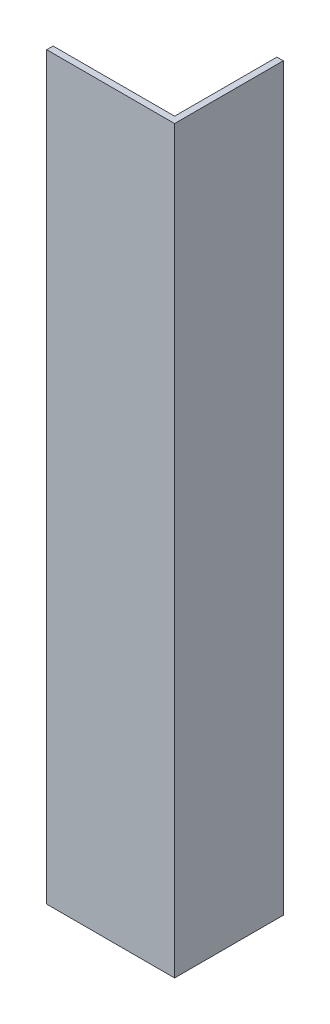
ISO-10303-21;
HEADER;
FILE_DESCRIPTION(('STEP AP214'),'2;1');
FILE_NAME('part.step','',(''),(''),'','','');
FILE_SCHEMA(('AUTOMOTIVE_DESIGN { 1 0 10303 214 1 1 1 1 }'));
ENDSEC;
DATA;
#1=APPLICATION_CONTEXT('core data for automotive mechanical design processes');
#2=APPLICATION_PROTOCOL_DEFINITION('international standard','automotive_design',2000,#1);
#3=PRODUCT_CONTEXT('',#1,'mechanical');
#4=PRODUCT('Part','Part','',(#3));
#5=PRODUCT_RELATED_PRODUCT_CATEGORY('part','',(#4));
#6=PRODUCT_DEFINITION_FORMATION('','',#4);
#7=PRODUCT_DEFINITION_CONTEXT('part definition',#1,'design');
#8=PRODUCT_DEFINITION('design','',#6,#7);
#9=PRODUCT_DEFINITION_SHAPE('','',#8);
#10=(LENGTH_UNIT() NAMED_UNIT(*) SI_UNIT(.MILLI.,.METRE.));
#11=(NAMED_UNIT(*) PLANE_ANGLE_UNIT() SI_UNIT($,.RADIAN.));
#12=(NAMED_UNIT(*) SI_UNIT($,.STERADIAN.) SOLID_ANGLE_UNIT());
#13=UNCERTAINTY_MEASURE_WITH_UNIT(LENGTH_MEASURE(1.E-05),#10,'distance_accuracy_value','');
#14=(GEOMETRIC_REPRESENTATION_CONTEXT(3) GLOBAL_UNCERTAINTY_ASSIGNED_CONTEXT((#13)) GLOBAL_UNIT_ASSIGNED_CONTEXT((#10,
#11,#12)) REPRESENTATION_CONTEXT('',''));
#15=CARTESIAN_POINT('',(0.,0.,0.));
#16=DIRECTION('',(0.,0.,1.));
#17=DIRECTION('',(1.,0.,0.));
#18=AXIS2_PLACEMENT_3D('',#15,#16,#17);
#19=CARTESIAN_POINT('',(190.896875000006,457.2,107.95));
#20=DIRECTION('',(1.,0.,0.));
#21=DIRECTION('',(0.,1.,0.));
#22=AXIS2_PLACEMENT_3D('',#19,#20,#21);
#23=PLANE('',#22);
#24=DIRECTION('',(0.,-1.,0.));
#25=VECTOR('',#24,1.);
#26=CARTESIAN_POINT('',(190.896875000006,457.2,101.6));
#27=LINE('',#26,#25);
#28=CARTESIAN_POINT('',(190.896875000006,457.2,101.6));
#29=VERTEX_POINT('',#28);
#30=CARTESIAN_POINT('',(190.896875000006,-277.541844670853,101.6));
#31=VERTEX_POINT('',#30);
#32=EDGE_CURVE('E54',#29,#31,#27,.T.);
#33=ORIENTED_EDGE('',*,*,#32,.F.);
#34=DIRECTION('',(0.,0.,-1.));
#35=VECTOR('',#34,1.);
#36=CARTESIAN_POINT('',(190.896875000006,457.2,107.95));
#37=LINE('',#36,#35);
#38=CARTESIAN_POINT('',(190.896875000006,457.2,0.));
#39=VERTEX_POINT('',#38);
#40=EDGE_CURVE('E47',#29,#39,#37,.T.);
#41=ORIENTED_EDGE('',*,*,#40,.T.);
#42=DIRECTION('',(0.,-1.,0.));
#43=VECTOR('',#42,1.);
#44=CARTESIAN_POINT('',(190.896875000006,457.2,0.));
#45=LINE('',#44,#43);
#46=CARTESIAN_POINT('',(190.896875000006,-277.541844670853,0.));
#47=VERTEX_POINT('',#46);
#48=EDGE_CURVE('E93',#39,#47,#45,.T.);
#49=ORIENTED_EDGE('',*,*,#48,.T.);
#50=DIRECTION('',(0.,0.,-1.));
#51=VECTOR('',#50,1.);
#52=CARTESIAN_POINT('',(190.896875000006,-277.541844670853,107.95));
#53=LINE('',#52,#51);
#54=EDGE_CURVE('E87',#31,#47,#53,.T.);
#55=ORIENTED_EDGE('',*,*,#54,.F.);
#56=EDGE_LOOP('',(#33,#41,#49,#55));
#57=FACE_BOUND('',#56,.T.);
#58=ADVANCED_FACE('F39',(#57),#23,.F.);
#59=CARTESIAN_POINT('',(197.246875000006,457.2,107.95));
#60=DIRECTION('',(-1.,0.,0.));
#61=DIRECTION('',(0.,-1.,0.));
#62=AXIS2_PLACEMENT_3D('',#59,#60,#61);
#63=PLANE('',#62);
#64=DIRECTION('',(0.,1.,0.));
#65=VECTOR('',#64,1.);
#66=CARTESIAN_POINT('',(197.246875000006,457.2,0.));
#67=LINE('',#66,#65);
#68=CARTESIAN_POINT('',(197.246875000006,-277.541844670854,0.));
#69=VERTEX_POINT('',#68);
#70=CARTESIAN_POINT('',(197.246875000006,457.2,0.));
#71=VERTEX_POINT('',#70);
#72=EDGE_CURVE('E98',#69,#71,#67,.T.);
#73=ORIENTED_EDGE('',*,*,#72,.T.);
#74=DIRECTION('',(0.,0.,-1.));
#75=VECTOR('',#74,1.);
#76=CARTESIAN_POINT('',(197.246875000006,457.2,107.95));
#77=LINE('',#76,#75);
#78=CARTESIAN_POINT('',(197.246875000006,457.2,107.95));
#79=VERTEX_POINT('',#78);
#80=EDGE_CURVE('E11',#79,#71,#77,.T.);
#81=ORIENTED_EDGE('',*,*,#80,.F.);
#82=DIRECTION('',(0.,1.,0.));
#83=VECTOR('',#82,1.);
#84=CARTESIAN_POINT('',(197.246875000006,457.2,107.95));
#85=LINE('',#84,#83);
#86=CARTESIAN_POINT('',(197.246875000006,-277.541844670854,107.95));
#87=VERTEX_POINT('',#86);
#88=EDGE_CURVE('E92',#87,#79,#85,.T.);
#89=ORIENTED_EDGE('',*,*,#88,.F.);
#90=DIRECTION('',(0.,0.,-1.));
#91=VECTOR('',#90,1.);
#92=CARTESIAN_POINT('',(197.246875000006,-277.541844670854,107.95));
#93=LINE('',#92,#91);
#94=EDGE_CURVE('E84',#87,#69,#93,.T.);
#95=ORIENTED_EDGE('',*,*,#94,.T.);
#96=EDGE_LOOP('',(#73,#81,#89,#95));
#97=FACE_BOUND('',#96,.T.);
#98=ADVANCED_FACE('F41',(#97),#63,.F.);
#99=CARTESIAN_POINT('',(197.246875000006,457.2,107.95));
#100=DIRECTION('',(0.,-1.,0.));
#101=DIRECTION('',(0.,0.,-1.));
#102=AXIS2_PLACEMENT_3D('',#99,#100,#101);
#103=PLANE('',#102);
#104=DIRECTION('',(-1.,0.,0.));
#105=VECTOR('',#104,1.);
#106=CARTESIAN_POINT('',(197.246875000006,457.2,0.));
#107=LINE('',#106,#105);
#108=EDGE_CURVE('E102',#71,#39,#107,.T.);
#109=ORIENTED_EDGE('',*,*,#108,.T.);
#110=ORIENTED_EDGE('',*,*,#40,.F.);
#111=DIRECTION('',(1.,0.,0.));
#112=VECTOR('',#111,1.);
#113=CARTESIAN_POINT('',(70.2468750000061,457.2,101.6));
#114=LINE('',#113,#112);
#115=CARTESIAN_POINT('',(70.2468750000061,457.2,101.6));
#116=VERTEX_POINT('',#115);
#117=EDGE_CURVE('E103',#116,#29,#114,.T.);
#118=ORIENTED_EDGE('',*,*,#117,.F.);
#119=DIRECTION('',(0.,0.,-1.));
#120=VECTOR('',#119,1.);
#121=CARTESIAN_POINT('',(70.2468750000061,457.2,107.95));
#122=LINE('',#121,#120);
#123=CARTESIAN_POINT('',(70.2468750000061,457.2,107.95));
#124=VERTEX_POINT('',#123);
#125=EDGE_CURVE('E121',#124,#116,#122,.T.);
#126=ORIENTED_EDGE('',*,*,#125,.F.);
#127=DIRECTION('',(-1.,0.,0.));
#128=VECTOR('',#127,1.);
#129=CARTESIAN_POINT('',(197.246875000006,457.2,107.95));
#130=LINE('',#129,#128);
#131=EDGE_CURVE('E118',#79,#124,#130,.T.);
#132=ORIENTED_EDGE('',*,*,#131,.F.);
#133=ORIENTED_EDGE('',*,*,#80,.T.);
#134=EDGE_LOOP('',(#109,#110,#118,#126,#132,#133));
#135=FACE_BOUND('',#134,.T.);
#136=ADVANCED_FACE('F115',(#135),#103,.F.);
#137=CARTESIAN_POINT('',(197.246875000006,-277.541844670854,107.95));
#138=DIRECTION('',(0.,1.,0.));
#139=DIRECTION('',(-1.,0.,0.));
#140=AXIS2_PLACEMENT_3D('',#137,#138,#139);
#141=PLANE('',#140);
#142=DIRECTION('',(1.,0.,0.));
#143=VECTOR('',#142,1.);
#144=CARTESIAN_POINT('',(197.246875000006,-277.541844670854,0.));
#145=LINE('',#144,#143);
#146=EDGE_CURVE('E81',#47,#69,#145,.T.);
#147=ORIENTED_EDGE('',*,*,#146,.T.);
#148=ORIENTED_EDGE('',*,*,#94,.F.);
#149=DIRECTION('',(1.,0.,0.));
#150=VECTOR('',#149,1.);
#151=CARTESIAN_POINT('',(197.246875000006,-277.541844670854,107.95));
#152=LINE('',#151,#150);
#153=CARTESIAN_POINT('',(70.2468750000062,-277.541844670853,107.95));
#154=VERTEX_POINT('',#153);
#155=EDGE_CURVE('E63',#154,#87,#152,.T.);
#156=ORIENTED_EDGE('',*,*,#155,.F.);
#157=DIRECTION('',(0.,0.,1.));
#158=VECTOR('',#157,1.);
#159=CARTESIAN_POINT('',(70.2468750000062,-277.541844670853,107.95));
#160=LINE('',#159,#158);
#161=CARTESIAN_POINT('',(70.2468750000062,-277.541844670853,101.6));
#162=VERTEX_POINT('',#161);
#163=EDGE_CURVE('E127',#162,#154,#160,.T.);
#164=ORIENTED_EDGE('',*,*,#163,.F.);
#165=DIRECTION('',(1.,0.,0.));
#166=VECTOR('',#165,1.);
#167=CARTESIAN_POINT('',(70.2468750000062,-277.541844670853,101.6));
#168=LINE('',#167,#166);
#169=EDGE_CURVE('E107',#162,#31,#168,.T.);
#170=ORIENTED_EDGE('',*,*,#169,.T.);
#171=ORIENTED_EDGE('',*,*,#54,.T.);
#172=EDGE_LOOP('',(#147,#148,#156,#164,#170,#171));
#173=FACE_BOUND('',#172,.T.);
#174=ADVANCED_FACE('F83',(#173),#141,.F.);
#175=CARTESIAN_POINT('',(0.,0.,107.95));
#176=DIRECTION('',(0.,0.,-1.));
#177=DIRECTION('',(-1.,0.,0.));
#178=AXIS2_PLACEMENT_3D('',#175,#176,#177);
#179=PLANE('',#178);
#180=ORIENTED_EDGE('',*,*,#88,.T.);
#181=ORIENTED_EDGE('',*,*,#131,.T.);
#182=DIRECTION('',(0.,1.,0.));
#183=VECTOR('',#182,1.);
#184=CARTESIAN_POINT('',(70.2468750000061,457.2,107.95));
#185=LINE('',#184,#183);
#186=EDGE_CURVE('E129',#154,#124,#185,.T.);
#187=ORIENTED_EDGE('',*,*,#186,.F.);
#188=ORIENTED_EDGE('',*,*,#155,.T.);
#189=EDGE_LOOP('',(#180,#181,#187,#188));
#190=FACE_BOUND('',#189,.T.);
#191=ADVANCED_FACE('F123',(#190),#179,.F.);
#192=CARTESIAN_POINT('',(0.,0.,0.));
#193=DIRECTION('',(0.,0.,-1.));
#194=DIRECTION('',(-1.,0.,0.));
#195=AXIS2_PLACEMENT_3D('',#192,#193,#194);
#196=PLANE('',#195);
#197=ORIENTED_EDGE('',*,*,#72,.F.);
#198=ORIENTED_EDGE('',*,*,#146,.F.);
#199=ORIENTED_EDGE('',*,*,#48,.F.);
#200=ORIENTED_EDGE('',*,*,#108,.F.);
#201=EDGE_LOOP('',(#197,#198,#199,#200));
#202=FACE_BOUND('',#201,.T.);
#203=ADVANCED_FACE('F100',(#202),#196,.T.);
#204=CARTESIAN_POINT('',(70.2468750000061,457.2,101.6));
#205=DIRECTION('',(0.,0.,1.));
#206=DIRECTION('',(0.,-1.,0.));
#207=AXIS2_PLACEMENT_3D('',#204,#205,#206);
#208=PLANE('',#207);
#209=ORIENTED_EDGE('',*,*,#32,.T.);
#210=ORIENTED_EDGE('',*,*,#169,.F.);
#211=DIRECTION('',(0.,-1.,0.));
#212=VECTOR('',#211,1.);
#213=CARTESIAN_POINT('',(70.2468750000061,457.2,101.6));
#214=LINE('',#213,#212);
#215=EDGE_CURVE('E132',#116,#162,#214,.T.);
#216=ORIENTED_EDGE('',*,*,#215,.F.);
#217=ORIENTED_EDGE('',*,*,#117,.T.);
#218=EDGE_LOOP('',(#209,#210,#216,#217));
#219=FACE_BOUND('',#218,.T.);
#220=ADVANCED_FACE('F148',(#219),#208,.F.);
#221=CARTESIAN_POINT('',(70.2468750000061,0.,0.));
#222=DIRECTION('',(1.,0.,0.));
#223=DIRECTION('',(0.,1.,0.));
#224=AXIS2_PLACEMENT_3D('',#221,#222,#223);
#225=PLANE('',#224);
#226=ORIENTED_EDGE('',*,*,#186,.T.);
#227=ORIENTED_EDGE('',*,*,#125,.T.);
#228=ORIENTED_EDGE('',*,*,#215,.T.);
#229=ORIENTED_EDGE('',*,*,#163,.T.);
#230=EDGE_LOOP('',(#226,#227,#228,#229));
#231=FACE_BOUND('',#230,.T.);
#232=ADVANCED_FACE('F137',(#231),#225,.F.);
#233=CLOSED_SHELL('',(#58,#98,#136,#174,#191,#203,#220,#232));
#234=MANIFOLD_SOLID_BREP('B2',#233);
#235=ADVANCED_BREP_SHAPE_REPRESENTATION('',(#18,#234),#14);
#236=SHAPE_DEFINITION_REPRESENTATION(#9,#235);
ENDSEC;
END-ISO-10303-21;
